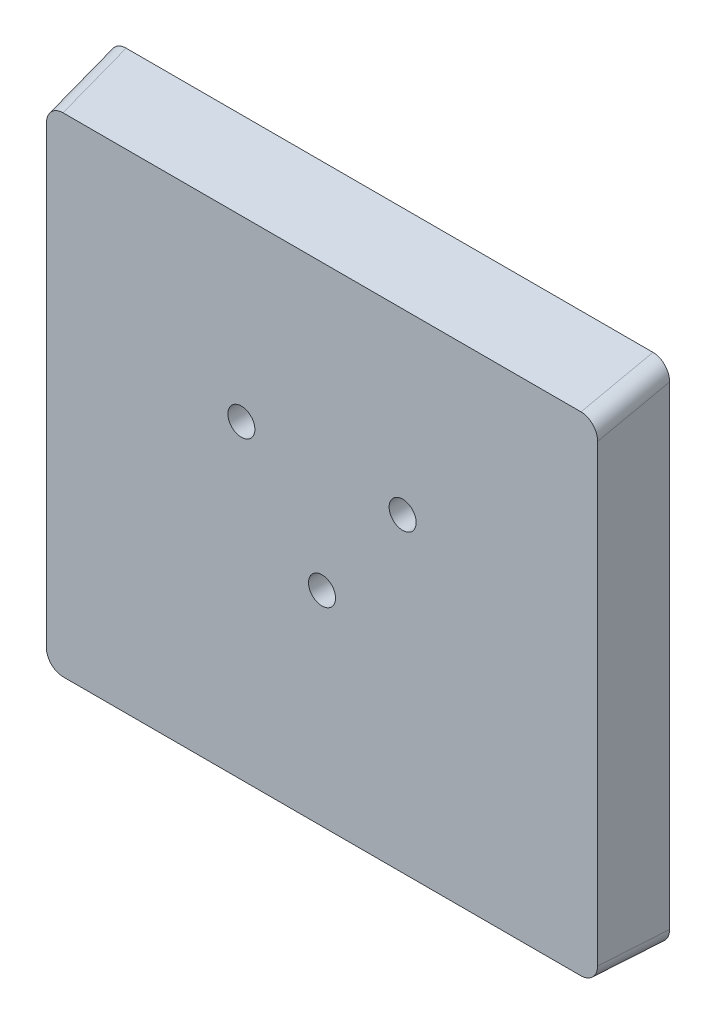
ISO-10303-21;
HEADER;
FILE_DESCRIPTION(('STEP AP214'),'2;1');
FILE_NAME('part.step','',(''),(''),'','','');
FILE_SCHEMA(('AUTOMOTIVE_DESIGN { 1 0 10303 214 1 1 1 1 }'));
ENDSEC;
DATA;
#1=APPLICATION_CONTEXT('core data for automotive mechanical design processes');
#2=APPLICATION_PROTOCOL_DEFINITION('international standard','automotive_design',2000,#1);
#3=PRODUCT_CONTEXT('',#1,'mechanical');
#4=PRODUCT('Part','Part','',(#3));
#5=PRODUCT_RELATED_PRODUCT_CATEGORY('part','',(#4));
#6=PRODUCT_DEFINITION_FORMATION('','',#4);
#7=PRODUCT_DEFINITION_CONTEXT('part definition',#1,'design');
#8=PRODUCT_DEFINITION('design','',#6,#7);
#9=PRODUCT_DEFINITION_SHAPE('','',#8);
#10=(LENGTH_UNIT() NAMED_UNIT(*) SI_UNIT(.MILLI.,.METRE.));
#11=(NAMED_UNIT(*) PLANE_ANGLE_UNIT() SI_UNIT($,.RADIAN.));
#12=(NAMED_UNIT(*) SI_UNIT($,.STERADIAN.) SOLID_ANGLE_UNIT());
#13=UNCERTAINTY_MEASURE_WITH_UNIT(LENGTH_MEASURE(1.E-05),#10,'distance_accuracy_value','');
#14=(GEOMETRIC_REPRESENTATION_CONTEXT(3) GLOBAL_UNCERTAINTY_ASSIGNED_CONTEXT((#13)) GLOBAL_UNIT_ASSIGNED_CONTEXT((#10,
#11,#12)) REPRESENTATION_CONTEXT('',''));
#15=CARTESIAN_POINT('',(0.,0.,0.));
#16=DIRECTION('',(0.,0.,1.));
#17=DIRECTION('',(1.,0.,0.));
#18=AXIS2_PLACEMENT_3D('',#15,#16,#17);
#19=CARTESIAN_POINT('',(0.,0.,0.));
#20=DIRECTION('',(0.,0.,-1.));
#21=DIRECTION('',(0.,1.,0.));
#22=AXIS2_PLACEMENT_3D('',#19,#20,#21);
#23=PLANE('',#22);
#24=CARTESIAN_POINT('',(-6.89480048776039E-10,140.918830549793,-3.49720252756924E-12));
#25=DIRECTION('',(0.,0.,-1.));
#26=DIRECTION('',(0.,1.,0.));
#27=AXIS2_PLACEMENT_3D('',#24,#25,#26);
#28=CIRCLE('',#27,10.16);
#29=CARTESIAN_POINT('',(-6.89480048776039E-10,151.078830549793,-3.74972053489617E-12));
#30=VERTEX_POINT('',#29);
#31=EDGE_CURVE('E365',#30,#30,#28,.T.);
#32=ORIENTED_EDGE('',*,*,#31,.T.);
#33=EDGE_LOOP('',(#32));
#34=FACE_BOUND('',#33,.T.);
#35=CARTESIAN_POINT('',(-60.6219373498962,220.459221855587,-5.49560397189452E-12));
#36=DIRECTION('',(0.,0.,-1.));
#37=DIRECTION('',(0.,1.,0.));
#38=AXIS2_PLACEMENT_3D('',#35,#36,#37);
#39=CIRCLE('',#38,10.16);
#40=CARTESIAN_POINT('',(-60.6219373498962,230.619221855587,-5.74812197922145E-12));
#41=VERTEX_POINT('',#40);
#42=EDGE_CURVE('E132',#41,#41,#39,.T.);
#43=ORIENTED_EDGE('',*,*,#42,.T.);
#44=EDGE_LOOP('',(#43));
#45=FACE_BOUND('',#44,.T.);
#46=CARTESIAN_POINT('',(60.6219373498894,220.459221855587,-5.49560397189452E-12));
#47=DIRECTION('',(0.,0.,-1.));
#48=DIRECTION('',(0.,1.,0.));
#49=AXIS2_PLACEMENT_3D('',#46,#47,#48);
#50=CIRCLE('',#49,10.16);
#51=CARTESIAN_POINT('',(60.6219373498894,230.619221855587,-5.74812197922145E-12));
#52=VERTEX_POINT('',#51);
#53=EDGE_CURVE('E369',#52,#52,#50,.T.);
#54=ORIENTED_EDGE('',*,*,#53,.T.);
#55=EDGE_LOOP('',(#54));
#56=FACE_BOUND('',#55,.T.);
#57=CARTESIAN_POINT('',(-194.477146959502,341.258721710798,-8.47932835057463E-12));
#58=DIRECTION('',(0.,0.,-1.));
#59=DIRECTION('',(-0.215862503296011,0.976423770537557,0.));
#60=AXIS2_PLACEMENT_3D('',#57,#58,#59);
#61=ELLIPSE('',#60,13.2682097322358,12.7);
#62=CARTESIAN_POINT('',(-194.712004029959,354.500996372514,-8.80892581101023E-12));
#63=VERTEX_POINT('',#62);
#64=CARTESIAN_POINT('',(-207.204187121389,341.503086605831,-8.47932835057463E-12));
#65=VERTEX_POINT('',#64);
#66=EDGE_CURVE('E231',#63,#65,#61,.F.);
#67=ORIENTED_EDGE('',*,*,#66,.T.);
#68=DIRECTION('',(0.,1.,0.));
#69=VECTOR('',#68,1.);
#70=CARTESIAN_POINT('',(-207.204187121388,-12.6999999999987,3.12250225675825E-13));
#71=LINE('',#70,#69);
#72=CARTESIAN_POINT('',(-207.204187121388,0.,0.));
#73=VERTEX_POINT('',#72);
#74=EDGE_CURVE('E66',#73,#65,#71,.T.);
#75=ORIENTED_EDGE('',*,*,#74,.F.);
#76=CARTESIAN_POINT('',(-194.477146959501,0.,0.));
#77=DIRECTION('',(0.,0.,-1.));
#78=DIRECTION('',(1.,-3.80671022278096E-13,0.));
#79=AXIS2_PLACEMENT_3D('',#76,#77,#78);
#80=ELLIPSE('',#79,12.7270401618867,12.7);
#81=CARTESIAN_POINT('',(-194.477146959501,-12.7,3.12250225675825E-13));
#82=VERTEX_POINT('',#81);
#83=EDGE_CURVE('E228',#73,#82,#80,.F.);
#84=ORIENTED_EDGE('',*,*,#83,.T.);
#85=DIRECTION('',(-1.,0.,0.));
#86=VECTOR('',#85,1.);
#87=CARTESIAN_POINT('',(254.,-12.7,3.15719672627779E-13));
#88=LINE('',#87,#86);
#89=CARTESIAN_POINT('',(194.477146959501,-12.7,3.15719672627779E-13));
#90=VERTEX_POINT('',#89);
#91=EDGE_CURVE('E235',#90,#82,#88,.T.);
#92=ORIENTED_EDGE('',*,*,#91,.F.);
#93=CARTESIAN_POINT('',(194.477146959501,0.,0.));
#94=DIRECTION('',(0.,0.,-1.));
#95=DIRECTION('',(-1.,-3.80671022278096E-13,0.));
#96=AXIS2_PLACEMENT_3D('',#93,#94,#95);
#97=ELLIPSE('',#96,12.7270401618867,12.7);
#98=CARTESIAN_POINT('',(207.204187121388,0.,0.));
#99=VERTEX_POINT('',#98);
#100=EDGE_CURVE('E224',#90,#99,#97,.F.);
#101=ORIENTED_EDGE('',*,*,#100,.T.);
#102=DIRECTION('',(0.,-1.,0.));
#103=VECTOR('',#102,1.);
#104=CARTESIAN_POINT('',(207.204187121388,-12.6999999999987,3.12250225675825E-13));
#105=LINE('',#104,#103);
#106=CARTESIAN_POINT('',(207.204187121389,341.503086605831,-8.48626724447854E-12));
#107=VERTEX_POINT('',#106);
#108=EDGE_CURVE('E237',#107,#99,#105,.T.);
#109=ORIENTED_EDGE('',*,*,#108,.F.);
#110=CARTESIAN_POINT('',(194.477146959502,341.258721710798,-8.47932835057463E-12));
#111=DIRECTION('',(0.,0.,-1.));
#112=DIRECTION('',(0.215862503296011,0.976423770537557,0.));
#113=AXIS2_PLACEMENT_3D('',#110,#111,#112);
#114=ELLIPSE('',#113,13.2682097322358,12.7);
#115=CARTESIAN_POINT('',(194.712004029959,354.500996372514,-8.81239525796218E-12));
#116=VERTEX_POINT('',#115);
#117=EDGE_CURVE('E114',#107,#116,#114,.F.);
#118=ORIENTED_EDGE('',*,*,#117,.T.);
#119=DIRECTION('',(1.,0.,0.));
#120=VECTOR('',#119,1.);
#121=CARTESIAN_POINT('',(254.,354.500996372514,-8.81239525796218E-12));
#122=LINE('',#121,#120);
#123=EDGE_CURVE('E58',#63,#116,#122,.T.);
#124=ORIENTED_EDGE('',*,*,#123,.F.);
#125=EDGE_LOOP('',(#67,#75,#84,#92,#101,#109,#118,#124));
#126=FACE_BOUND('',#125,.T.);
#127=ADVANCED_FACE('F41',(#34,#45,#56,#126),#23,.F.);
#128=CARTESIAN_POINT('',(0.,-1.26259003663461E-12,-50.8));
#129=DIRECTION('',(0.,0.,-1.));
#130=DIRECTION('',(0.,1.,0.));
#131=AXIS2_PLACEMENT_3D('',#128,#129,#130);
#132=PLANE('',#131);
#133=CARTESIAN_POINT('',(-6.89480048776039E-10,140.918830549792,-50.8000000000035));
#134=DIRECTION('',(0.,0.,-1.));
#135=DIRECTION('',(0.,1.,0.));
#136=AXIS2_PLACEMENT_3D('',#133,#134,#135);
#137=CIRCLE('',#136,10.16);
#138=CARTESIAN_POINT('',(-6.89480048776039E-10,151.078830549792,-50.8000000000037));
#139=VERTEX_POINT('',#138);
#140=EDGE_CURVE('E45',#139,#139,#137,.T.);
#141=ORIENTED_EDGE('',*,*,#140,.F.);
#142=EDGE_LOOP('',(#141));
#143=FACE_BOUND('',#142,.T.);
#144=CARTESIAN_POINT('',(-60.6219373498962,220.459221855586,-50.8000000000055));
#145=DIRECTION('',(0.,0.,-1.));
#146=DIRECTION('',(0.,1.,0.));
#147=AXIS2_PLACEMENT_3D('',#144,#145,#146);
#148=CIRCLE('',#147,10.16);
#149=CARTESIAN_POINT('',(-60.6219373498962,230.619221855586,-50.8000000000057));
#150=VERTEX_POINT('',#149);
#151=EDGE_CURVE('E372',#150,#150,#148,.T.);
#152=ORIENTED_EDGE('',*,*,#151,.F.);
#153=EDGE_LOOP('',(#152));
#154=FACE_BOUND('',#153,.T.);
#155=CARTESIAN_POINT('',(60.6219373498894,220.459221855586,-50.8000000000055));
#156=DIRECTION('',(0.,0.,-1.));
#157=DIRECTION('',(0.,1.,0.));
#158=AXIS2_PLACEMENT_3D('',#155,#156,#157);
#159=CIRCLE('',#158,10.16);
#160=CARTESIAN_POINT('',(60.6219373498894,230.619221855586,-50.8000000000057));
#161=VERTEX_POINT('',#160);
#162=EDGE_CURVE('E366',#161,#161,#159,.T.);
#163=ORIENTED_EDGE('',*,*,#162,.F.);
#164=EDGE_LOOP('',(#163));
#165=FACE_BOUND('',#164,.T.);
#166=CARTESIAN_POINT('',(197.793895445054,0.,-50.8000000000003));
#167=DIRECTION('',(0.,0.,1.));
#168=DIRECTION('',(-1.,-3.80671022278096E-13,0.));
#169=AXIS2_PLACEMENT_3D('',#166,#167,#168);
#170=ELLIPSE('',#169,12.7270401618867,12.7);
#171=CARTESIAN_POINT('',(210.520935606941,0.,-50.8));
#172=VERTEX_POINT('',#171);
#173=CARTESIAN_POINT('',(197.793895445054,-12.7,-50.7999999999996));
#174=VERTEX_POINT('',#173);
#175=EDGE_CURVE('E240',#172,#174,#170,.F.);
#176=ORIENTED_EDGE('',*,*,#175,.T.);
#177=DIRECTION('',(-1.,0.,0.));
#178=VECTOR('',#177,1.);
#179=CARTESIAN_POINT('',(254.,-12.7,-50.7999999999996));
#180=LINE('',#179,#178);
#181=CARTESIAN_POINT('',(-197.793895445054,-12.7,-50.7999999999996));
#182=VERTEX_POINT('',#181);
#183=EDGE_CURVE('E233',#174,#182,#180,.T.);
#184=ORIENTED_EDGE('',*,*,#183,.T.);
#185=CARTESIAN_POINT('',(-197.793895445054,0.,-50.8000000000003));
#186=DIRECTION('',(0.,0.,1.));
#187=DIRECTION('',(1.,-3.80671022278096E-13,0.));
#188=AXIS2_PLACEMENT_3D('',#185,#186,#187);
#189=ELLIPSE('',#188,12.7270401618867,12.7);
#190=CARTESIAN_POINT('',(-210.520935606941,0.,-50.8));
#191=VERTEX_POINT('',#190);
#192=EDGE_CURVE('E243',#182,#191,#189,.F.);
#193=ORIENTED_EDGE('',*,*,#192,.T.);
#194=DIRECTION('',(0.,1.,0.));
#195=VECTOR('',#194,1.);
#196=CARTESIAN_POINT('',(-210.520935606941,-12.7,-50.8));
#197=LINE('',#196,#195);
#198=CARTESIAN_POINT('',(-210.520935606941,356.505933384394,-50.8000000000088));
#199=VERTEX_POINT('',#198);
#200=EDGE_CURVE('E136',#191,#199,#197,.T.);
#201=ORIENTED_EDGE('',*,*,#200,.T.);
#202=CARTESIAN_POINT('',(-210.520935606941,356.505933384394,-50.8000000000088));
#203=CARTESIAN_POINT('',(-210.520935606941,359.107412283881,-50.8000000000089));
#204=CARTESIAN_POINT('',(-209.574492393918,361.498009219247,-50.800000000009));
#205=CARTESIAN_POINT('',(-208.628452244898,363.887588065457,-50.800000000009));
#206=CARTESIAN_POINT('',(-206.875926788601,365.711271798833,-50.8000000000091));
#207=CARTESIAN_POINT('',(-205.124409242434,367.533906697625,-50.8000000000091));
#208=CARTESIAN_POINT('',(-202.826595126724,368.519084651132,-50.8000000000091));
#209=CARTESIAN_POINT('',(-200.529759338137,369.503843151079,-50.8000000000092));
#210=CARTESIAN_POINT('',(-198.028752515511,369.503843151079,-50.8000000000092));
#211=B_SPLINE_CURVE_WITH_KNOTS('',2,(#202,#203,#204,#205,#206,#207,#208,#209,#210),
.UNSPECIFIED.,.F.,.F.,(3,2,2,2,3),(0.,0.25,0.5,0.75,1.),.UNSPECIFIED.);
#212=CARTESIAN_POINT('',(-198.028752515511,369.50384315108,-50.8000000000003));
#213=VERTEX_POINT('',#212);
#214=EDGE_CURVE('E131',#199,#213,#211,.T.);
#215=ORIENTED_EDGE('',*,*,#214,.T.);
#216=DIRECTION('',(1.,0.,0.));
#217=VECTOR('',#216,1.);
#218=CARTESIAN_POINT('',(254.,369.50384315108,-50.8000000000095));
#219=LINE('',#218,#217);
#220=CARTESIAN_POINT('',(198.028752515511,369.503843151079,-50.8000000000091));
#221=VERTEX_POINT('',#220);
#222=EDGE_CURVE('E124',#221,#213,#219,.F.);
#223=ORIENTED_EDGE('',*,*,#222,.F.);
#224=CARTESIAN_POINT('',(198.028752515511,369.503843151079,-50.8000000000092));
#225=CARTESIAN_POINT('',(200.529112739401,369.503843151079,-50.8000000000092));
#226=CARTESIAN_POINT('',(202.826595126724,368.519084651132,-50.8000000000091));
#227=CARTESIAN_POINT('',(205.123362163114,367.534632768514,-50.8000000000091));
#228=CARTESIAN_POINT('',(206.875926788601,365.711271798833,-50.8000000000091));
#229=CARTESIAN_POINT('',(208.627754456647,363.888677556618,-50.800000000009));
#230=CARTESIAN_POINT('',(209.574492393918,361.498009219247,-50.800000000009));
#231=CARTESIAN_POINT('',(210.520935606941,359.108085108867,-50.8000000000089));
#232=CARTESIAN_POINT('',(210.520935606941,356.505933384394,-50.8000000000088));
#233=B_SPLINE_CURVE_WITH_KNOTS('',2,(#224,#225,#226,#227,#228,#229,#230,#231,#232),
.UNSPECIFIED.,.F.,.F.,(3,2,2,2,3),(0.,0.25,0.5,0.75,1.),.UNSPECIFIED.);
#234=CARTESIAN_POINT('',(210.520935606941,356.505933384394,-50.8000000000088));
#235=VERTEX_POINT('',#234);
#236=EDGE_CURVE('E112',#221,#235,#233,.T.);
#237=ORIENTED_EDGE('',*,*,#236,.T.);
#238=DIRECTION('',(0.,1.,0.));
#239=VECTOR('',#238,1.);
#240=CARTESIAN_POINT('',(210.520935606941,-12.7,-50.8));
#241=LINE('',#240,#239);
#242=EDGE_CURVE('E118',#172,#235,#241,.T.);
#243=ORIENTED_EDGE('',*,*,#242,.F.);
#244=EDGE_LOOP('',(#176,#184,#193,#201,#215,#223,#237,#243));
#245=FACE_BOUND('',#244,.T.);
#246=ADVANCED_FACE('F128',(#143,#154,#165,#245),#132,.T.);
#247=CARTESIAN_POINT('',(210.520935606941,-12.7,-50.8));
#248=DIRECTION('',(-0.997875377028538,0.,-0.0651516071954638));
#249=DIRECTION('',(-0.0651516071954638,0.,0.997875377028539));
#250=AXIS2_PLACEMENT_3D('',#247,#248,#249);
#251=PLANE('',#250);
#252=DIRECTION('',(0.0624942730120991,0.282684082505031,-0.957175101712836));
#253=VECTOR('',#252,1.);
#254=CARTESIAN_POINT('',(203.998493291496,327.002579992691,49.0990641189351));
#255=LINE('',#254,#253);
#256=EDGE_CURVE('E11',#235,#107,#255,.F.);
#257=ORIENTED_EDGE('',*,*,#256,.T.);
#258=ORIENTED_EDGE('',*,*,#108,.T.);
#259=DIRECTION('',(-0.0651516071954638,0.,0.997875377028539));
#260=VECTOR('',#259,1.);
#261=CARTESIAN_POINT('',(210.520935606941,0.,-50.8));
#262=LINE('',#261,#260);
#263=EDGE_CURVE('E50',#99,#172,#262,.F.);
#264=ORIENTED_EDGE('',*,*,#263,.T.);
#265=ORIENTED_EDGE('',*,*,#242,.T.);
#266=EDGE_LOOP('',(#257,#258,#264,#265));
#267=FACE_BOUND('',#266,.T.);
#268=ADVANCED_FACE('F119',(#267),#251,.F.);
#269=CARTESIAN_POINT('',(254.,-12.7,25.4));
#270=DIRECTION('',(0.,1.,0.));
#271=DIRECTION('',(0.,0.,1.));
#272=AXIS2_PLACEMENT_3D('',#269,#270,#271);
#273=PLANE('',#272);
#274=ORIENTED_EDGE('',*,*,#183,.F.);
#275=DIRECTION('',(-0.0651516071954638,0.,0.997875377028539));
#276=VECTOR('',#275,1.);
#277=CARTESIAN_POINT('',(193.078470625089,-12.7,21.4224135769334));
#278=LINE('',#277,#276);
#279=EDGE_CURVE('E218',#174,#90,#278,.T.);
#280=ORIENTED_EDGE('',*,*,#279,.T.);
#281=ORIENTED_EDGE('',*,*,#91,.T.);
#282=DIRECTION('',(0.0651516071954638,0.,0.997875377028539));
#283=VECTOR('',#282,1.);
#284=CARTESIAN_POINT('',(-190.922146809651,-12.7,54.4491113507813));
#285=LINE('',#284,#283);
#286=EDGE_CURVE('E216',#82,#182,#285,.F.);
#287=ORIENTED_EDGE('',*,*,#286,.T.);
#288=EDGE_LOOP('',(#274,#280,#281,#287));
#289=FACE_BOUND('',#288,.T.);
#290=ADVANCED_FACE('F171',(#289),#273,.F.);
#291=CARTESIAN_POINT('',(-197.847918318678,0.,-51.6274254113824));
#292=DIRECTION('',(0.0651516071954638,0.,0.997875377028539));
#293=DIRECTION('',(0.997875377028539,0.,-0.0651516071954638));
#294=AXIS2_PLACEMENT_3D('',#291,#292,#293);
#295=CYLINDRICAL_SURFACE('',#294,12.7);
#296=ORIENTED_EDGE('',*,*,#83,.F.);
#297=DIRECTION('',(0.0651516071954638,0.,0.997875377028539));
#298=VECTOR('',#297,1.);
#299=CARTESIAN_POINT('',(-210.520935606941,0.,-50.8));
#300=LINE('',#299,#298);
#301=EDGE_CURVE('E212',#191,#73,#300,.T.);
#302=ORIENTED_EDGE('',*,*,#301,.F.);
#303=ORIENTED_EDGE('',*,*,#192,.F.);
#304=ORIENTED_EDGE('',*,*,#286,.F.);
#305=EDGE_LOOP('',(#296,#302,#303,#304));
#306=FACE_BOUND('',#305,.T.);
#307=ADVANCED_FACE('F174',(#306),#295,.T.);
#308=CARTESIAN_POINT('',(-210.520935606941,-12.7,-50.8));
#309=DIRECTION('',(0.997875377028538,0.,-0.0651516071954638));
#310=DIRECTION('',(0.0651516071954638,0.,0.997875377028539));
#311=AXIS2_PLACEMENT_3D('',#308,#309,#310);
#312=PLANE('',#311);
#313=ORIENTED_EDGE('',*,*,#301,.T.);
#314=ORIENTED_EDGE('',*,*,#74,.T.);
#315=DIRECTION('',(-0.0624942730120991,0.282684082505031,-0.957175101712836));
#316=VECTOR('',#315,1.);
#317=CARTESIAN_POINT('',(-203.998493291496,327.002579992691,49.099064118935));
#318=LINE('',#317,#316);
#319=EDGE_CURVE('E211',#65,#199,#318,.T.);
#320=ORIENTED_EDGE('',*,*,#319,.T.);
#321=ORIENTED_EDGE('',*,*,#200,.F.);
#322=EDGE_LOOP('',(#313,#314,#320,#321));
#323=FACE_BOUND('',#322,.T.);
#324=ADVANCED_FACE('F178',(#323),#312,.F.);
#325=CARTESIAN_POINT('',(198.247350134501,358.312707204412,-57.7452050175861));
#326=DIRECTION('',(0.0624942730120991,0.282684082505031,-0.957175101712836));
#327=DIRECTION('',(0.,0.959049734613682,0.283237720894351));
#328=AXIS2_PLACEMENT_3D('',#325,#326,#327);
#329=CYLINDRICAL_SURFACE('',#328,12.7);
#330=ORIENTED_EDGE('',*,*,#117,.F.);
#331=ORIENTED_EDGE('',*,*,#256,.F.);
#332=ORIENTED_EDGE('',*,*,#236,.F.);
#333=DIRECTION('',(0.0624942730120991,0.282684082505031,-0.957175101712836));
#334=VECTOR('',#333,1.);
#335=CARTESIAN_POINT('',(198.247350134501,370.492638834005,-54.1480859622278));
#336=LINE('',#335,#334);
#337=EDGE_CURVE('E200',#116,#221,#336,.T.);
#338=ORIENTED_EDGE('',*,*,#337,.F.);
#339=EDGE_LOOP('',(#330,#331,#332,#338));
#340=FACE_BOUND('',#339,.T.);
#341=ADVANCED_FACE('F109',(#340),#329,.T.);
#342=CARTESIAN_POINT('',(-191.325476003233,327.002579992691,48.2716387075527));
#343=DIRECTION('',(-0.0624942730120991,0.282684082505031,-0.957175101712836));
#344=DIRECTION('',(0.,0.959049734613682,0.283237720894351));
#345=AXIS2_PLACEMENT_3D('',#342,#343,#344);
#346=CYLINDRICAL_SURFACE('',#345,12.7);
#347=ORIENTED_EDGE('',*,*,#66,.F.);
#348=DIRECTION('',(-0.0624942730120991,0.282684082505031,-0.957175101712836));
#349=VECTOR('',#348,1.);
#350=CARTESIAN_POINT('',(-196.263338781571,361.518241630057,-23.7605612018004));
#351=LINE('',#350,#349);
#352=EDGE_CURVE('E192',#213,#63,#351,.F.);
#353=ORIENTED_EDGE('',*,*,#352,.F.);
#354=ORIENTED_EDGE('',*,*,#214,.F.);
#355=ORIENTED_EDGE('',*,*,#319,.F.);
#356=EDGE_LOOP('',(#347,#353,#354,#355));
#357=FACE_BOUND('',#356,.T.);
#358=ADVANCED_FACE('F169',(#357),#346,.T.);
#359=CARTESIAN_POINT('',(254.,369.50384315108,-50.8000000000095));
#360=DIRECTION('',(0.,-0.959049734613682,-0.283237720894351));
#361=DIRECTION('',(0.,0.283237720894351,-0.959049734613682));
#362=AXIS2_PLACEMENT_3D('',#359,#360,#361);
#363=PLANE('',#362);
#364=ORIENTED_EDGE('',*,*,#352,.T.);
#365=ORIENTED_EDGE('',*,*,#123,.T.);
#366=ORIENTED_EDGE('',*,*,#337,.T.);
#367=ORIENTED_EDGE('',*,*,#222,.T.);
#368=EDGE_LOOP('',(#364,#365,#366,#367));
#369=FACE_BOUND('',#368,.T.);
#370=ADVANCED_FACE('F166',(#369),#363,.F.);
#371=CARTESIAN_POINT('',(193.078470625089,0.,21.4224135769334));
#372=DIRECTION('',(-0.0651516071954638,0.,0.997875377028539));
#373=DIRECTION('',(0.997875377028539,0.,0.0651516071954638));
#374=AXIS2_PLACEMENT_3D('',#371,#372,#373);
#375=CYLINDRICAL_SURFACE('',#374,12.7);
#376=ORIENTED_EDGE('',*,*,#100,.F.);
#377=ORIENTED_EDGE('',*,*,#279,.F.);
#378=ORIENTED_EDGE('',*,*,#175,.F.);
#379=ORIENTED_EDGE('',*,*,#263,.F.);
#380=EDGE_LOOP('',(#376,#377,#378,#379));
#381=FACE_BOUND('',#380,.T.);
#382=ADVANCED_FACE('F43',(#381),#375,.T.);
#383=CARTESIAN_POINT('',(60.6219373498894,220.459221855595,311.149999999995));
#384=DIRECTION('',(0.,0.,-1.));
#385=DIRECTION('',(0.,1.,0.));
#386=AXIS2_PLACEMENT_3D('',#383,#384,#385);
#387=CYLINDRICAL_SURFACE('',#386,10.16);
#388=ORIENTED_EDGE('',*,*,#162,.T.);
#389=EDGE_LOOP('',(#388));
#390=FACE_BOUND('',#389,.T.);
#391=ORIENTED_EDGE('',*,*,#53,.F.);
#392=EDGE_LOOP('',(#391));
#393=FACE_BOUND('',#392,.T.);
#394=ADVANCED_FACE('F160',(#390,#393),#387,.F.);
#395=CARTESIAN_POINT('',(-60.6219373498962,220.459221855595,311.149999999995));
#396=DIRECTION('',(0.,0.,-1.));
#397=DIRECTION('',(0.,1.,0.));
#398=AXIS2_PLACEMENT_3D('',#395,#396,#397);
#399=CYLINDRICAL_SURFACE('',#398,10.16);
#400=ORIENTED_EDGE('',*,*,#151,.T.);
#401=EDGE_LOOP('',(#400));
#402=FACE_BOUND('',#401,.T.);
#403=ORIENTED_EDGE('',*,*,#42,.F.);
#404=EDGE_LOOP('',(#403));
#405=FACE_BOUND('',#404,.T.);
#406=ADVANCED_FACE('F294',(#402,#405),#399,.F.);
#407=CARTESIAN_POINT('',(-6.89480048776039E-10,140.9188305498,253.999999999997));
#408=DIRECTION('',(0.,0.,-1.));
#409=DIRECTION('',(0.,1.,0.));
#410=AXIS2_PLACEMENT_3D('',#407,#408,#409);
#411=CYLINDRICAL_SURFACE('',#410,10.16);
#412=ORIENTED_EDGE('',*,*,#140,.T.);
#413=EDGE_LOOP('',(#412));
#414=FACE_BOUND('',#413,.T.);
#415=ORIENTED_EDGE('',*,*,#31,.F.);
#416=EDGE_LOOP('',(#415));
#417=FACE_BOUND('',#416,.T.);
#418=ADVANCED_FACE('F302',(#414,#417),#411,.F.);
#419=CLOSED_SHELL('',(#127,#246,#268,#290,#307,#324,#341,#358,#370,#382,#394,#406,#418));
#420=MANIFOLD_SOLID_BREP('B2',#419);
#421=ADVANCED_BREP_SHAPE_REPRESENTATION('',(#18,#420),#14);
#422=SHAPE_DEFINITION_REPRESENTATION(#9,#421);
ENDSEC;
END-ISO-10303-21;
